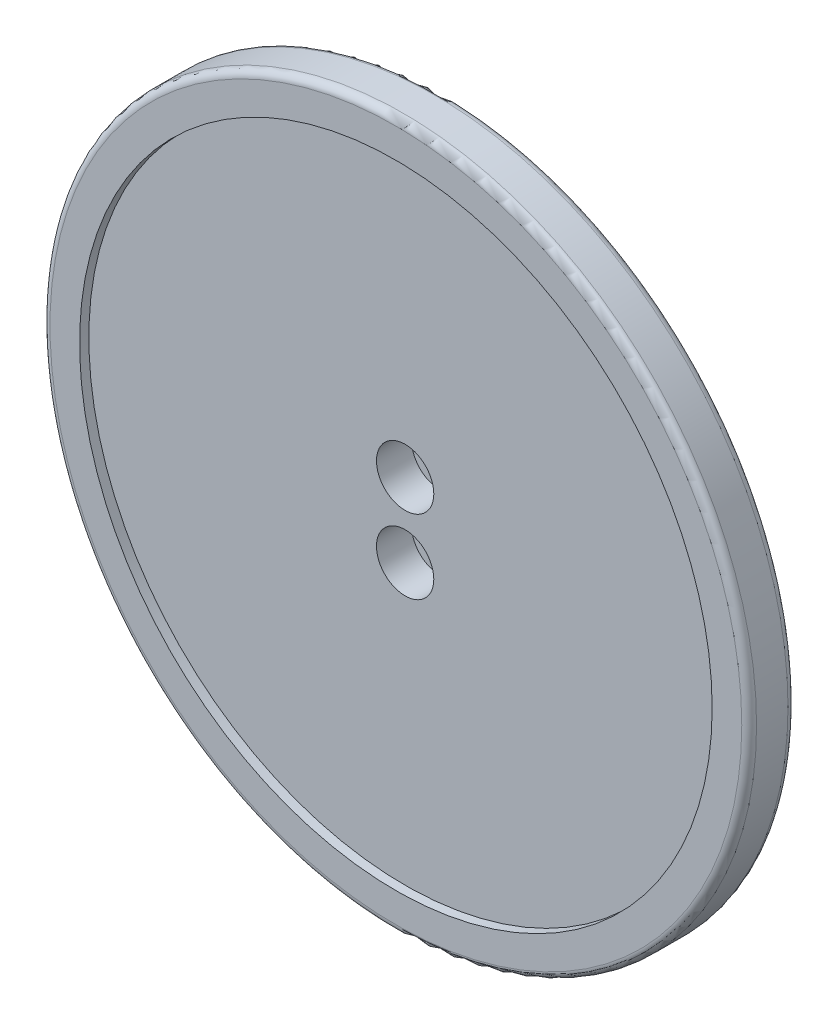
ISO-10303-21;
HEADER;
FILE_DESCRIPTION(('STEP AP214'),'2;1');
FILE_NAME('part.step','',(''),(''),'','','');
FILE_SCHEMA(('AUTOMOTIVE_DESIGN { 1 0 10303 214 1 1 1 1 }'));
ENDSEC;
DATA;
#1=APPLICATION_CONTEXT('core data for automotive mechanical design processes');
#2=APPLICATION_PROTOCOL_DEFINITION('international standard','automotive_design',2000,#1);
#3=PRODUCT_CONTEXT('',#1,'mechanical');
#4=PRODUCT('Part','Part','',(#3));
#5=PRODUCT_RELATED_PRODUCT_CATEGORY('part','',(#4));
#6=PRODUCT_DEFINITION_FORMATION('','',#4);
#7=PRODUCT_DEFINITION_CONTEXT('part definition',#1,'design');
#8=PRODUCT_DEFINITION('design','',#6,#7);
#9=PRODUCT_DEFINITION_SHAPE('','',#8);
#10=(LENGTH_UNIT() NAMED_UNIT(*) SI_UNIT(.MILLI.,.METRE.));
#11=(NAMED_UNIT(*) PLANE_ANGLE_UNIT() SI_UNIT($,.RADIAN.));
#12=(NAMED_UNIT(*) SI_UNIT($,.STERADIAN.) SOLID_ANGLE_UNIT());
#13=UNCERTAINTY_MEASURE_WITH_UNIT(LENGTH_MEASURE(1.E-05),#10,'distance_accuracy_value','');
#14=(GEOMETRIC_REPRESENTATION_CONTEXT(3) GLOBAL_UNCERTAINTY_ASSIGNED_CONTEXT((#13)) GLOBAL_UNIT_ASSIGNED_CONTEXT((#10,
#11,#12)) REPRESENTATION_CONTEXT('',''));
#15=CARTESIAN_POINT('',(0.,0.,0.));
#16=DIRECTION('',(0.,0.,1.));
#17=DIRECTION('',(1.,0.,0.));
#18=AXIS2_PLACEMENT_3D('',#15,#16,#17);
#19=CARTESIAN_POINT('',(0.,0.,-5.));
#20=DIRECTION('',(0.,0.,-1.));
#21=DIRECTION('',(-1.,0.,0.));
#22=AXIS2_PLACEMENT_3D('',#19,#20,#21);
#23=PLANE('',#22);
#24=CARTESIAN_POINT('',(0.,0.,-5.));
#25=DIRECTION('',(0.,0.,-1.));
#26=DIRECTION('',(-1.,0.,0.));
#27=AXIS2_PLACEMENT_3D('',#24,#25,#26);
#28=CIRCLE('',#27,46.75);
#29=CARTESIAN_POINT('',(-46.75,0.,-5.));
#30=VERTEX_POINT('',#29);
#31=EDGE_CURVE('E165',#30,#30,#28,.T.);
#32=ORIENTED_EDGE('',*,*,#31,.T.);
#33=EDGE_LOOP('',(#32));
#34=FACE_BOUND('',#33,.T.);
#35=DIRECTION('',(0.,-1.,0.));
#36=VECTOR('',#35,1.);
#37=CARTESIAN_POINT('',(-16.35,-10.,-5.));
#38=LINE('',#37,#36);
#39=CARTESIAN_POINT('',(-16.35,20.,-5.));
#40=VERTEX_POINT('',#39);
#41=CARTESIAN_POINT('',(-16.35,-20.,-5.));
#42=VERTEX_POINT('',#41);
#43=EDGE_CURVE('E63',#40,#42,#38,.T.);
#44=ORIENTED_EDGE('',*,*,#43,.T.);
#45=DIRECTION('',(1.,0.,0.));
#46=VECTOR('',#45,1.);
#47=CARTESIAN_POINT('',(6.35,-20.,-5.));
#48=LINE('',#47,#46);
#49=CARTESIAN_POINT('',(16.35,-20.,-5.));
#50=VERTEX_POINT('',#49);
#51=EDGE_CURVE('E162',#42,#50,#48,.T.);
#52=ORIENTED_EDGE('',*,*,#51,.T.);
#53=DIRECTION('',(0.,-1.,0.));
#54=VECTOR('',#53,1.);
#55=CARTESIAN_POINT('',(16.35,0.,-5.));
#56=LINE('',#55,#54);
#57=CARTESIAN_POINT('',(16.35,20.,-5.));
#58=VERTEX_POINT('',#57);
#59=EDGE_CURVE('E144',#50,#58,#56,.F.);
#60=ORIENTED_EDGE('',*,*,#59,.T.);
#61=DIRECTION('',(1.,0.,0.));
#62=VECTOR('',#61,1.);
#63=CARTESIAN_POINT('',(0.,20.,-5.));
#64=LINE('',#63,#62);
#65=EDGE_CURVE('E68',#58,#40,#64,.F.);
#66=ORIENTED_EDGE('',*,*,#65,.T.);
#67=EDGE_LOOP('',(#44,#52,#60,#66));
#68=FACE_BOUND('',#67,.T.);
#69=ADVANCED_FACE('F47',(#34,#68),#23,.T.);
#70=CARTESIAN_POINT('',(0.,-5.,-5.));
#71=DIRECTION('',(0.,0.,1.));
#72=DIRECTION('',(1.,0.,0.));
#73=AXIS2_PLACEMENT_3D('',#70,#71,#72);
#74=CYLINDRICAL_SURFACE('',#73,2.25);
#75=CARTESIAN_POINT('',(0.,-5.,-4.75));
#76=DIRECTION('',(0.,0.,1.));
#77=DIRECTION('',(1.,0.,0.));
#78=AXIS2_PLACEMENT_3D('',#75,#76,#77);
#79=CIRCLE('',#78,2.25);
#80=CARTESIAN_POINT('',(2.25,-5.,-4.75));
#81=VERTEX_POINT('',#80);
#82=EDGE_CURVE('E149',#81,#81,#79,.T.);
#83=ORIENTED_EDGE('',*,*,#82,.T.);
#84=EDGE_LOOP('',(#83));
#85=FACE_BOUND('',#84,.T.);
#86=CARTESIAN_POINT('',(0.,-5.,-15.));
#87=DIRECTION('',(0.,0.,-1.));
#88=DIRECTION('',(-1.,0.,0.));
#89=AXIS2_PLACEMENT_3D('',#86,#87,#88);
#90=CIRCLE('',#89,2.25);
#91=CARTESIAN_POINT('',(-2.25,-5.,-15.));
#92=VERTEX_POINT('',#91);
#93=EDGE_CURVE('E172',#92,#92,#90,.F.);
#94=ORIENTED_EDGE('',*,*,#93,.F.);
#95=EDGE_LOOP('',(#94));
#96=FACE_BOUND('',#95,.T.);
#97=ADVANCED_FACE('F193',(#85,#96),#74,.F.);
#98=CARTESIAN_POINT('',(0.,5.,-5.));
#99=DIRECTION('',(0.,0.,1.));
#100=DIRECTION('',(1.,0.,0.));
#101=AXIS2_PLACEMENT_3D('',#98,#99,#100);
#102=CYLINDRICAL_SURFACE('',#101,2.25);
#103=CARTESIAN_POINT('',(0.,5.,-4.75));
#104=DIRECTION('',(0.,0.,1.));
#105=DIRECTION('',(1.,0.,0.));
#106=AXIS2_PLACEMENT_3D('',#103,#104,#105);
#107=CIRCLE('',#106,2.25);
#108=CARTESIAN_POINT('',(2.25,5.,-4.75));
#109=VERTEX_POINT('',#108);
#110=EDGE_CURVE('E128',#109,#109,#107,.T.);
#111=ORIENTED_EDGE('',*,*,#110,.T.);
#112=EDGE_LOOP('',(#111));
#113=FACE_BOUND('',#112,.T.);
#114=CARTESIAN_POINT('',(0.,5.,-15.));
#115=DIRECTION('',(0.,0.,-1.));
#116=DIRECTION('',(-1.,0.,0.));
#117=AXIS2_PLACEMENT_3D('',#114,#115,#116);
#118=CIRCLE('',#117,2.25);
#119=CARTESIAN_POINT('',(-2.25,5.,-15.));
#120=VERTEX_POINT('',#119);
#121=EDGE_CURVE('E100',#120,#120,#118,.F.);
#122=ORIENTED_EDGE('',*,*,#121,.F.);
#123=EDGE_LOOP('',(#122));
#124=FACE_BOUND('',#123,.T.);
#125=ADVANCED_FACE('F200',(#113,#124),#102,.F.);
#126=CARTESIAN_POINT('',(0.,0.,1.25));
#127=DIRECTION('',(0.,0.,1.));
#128=DIRECTION('',(1.,0.,0.));
#129=AXIS2_PLACEMENT_3D('',#126,#127,#128);
#130=PLANE('',#129);
#131=CARTESIAN_POINT('',(0.,0.,1.25));
#132=DIRECTION('',(0.,0.,1.));
#133=DIRECTION('',(1.,0.,0.));
#134=AXIS2_PLACEMENT_3D('',#131,#132,#133);
#135=CIRCLE('',#134,46.75);
#136=CARTESIAN_POINT('',(46.75,0.,1.25));
#137=VERTEX_POINT('',#136);
#138=EDGE_CURVE('E11',#137,#137,#135,.T.);
#139=ORIENTED_EDGE('',*,*,#138,.T.);
#140=EDGE_LOOP('',(#139));
#141=FACE_BOUND('',#140,.T.);
#142=CARTESIAN_POINT('',(0.,0.,1.25));
#143=DIRECTION('',(0.,0.,1.));
#144=DIRECTION('',(1.,0.,0.));
#145=AXIS2_PLACEMENT_3D('',#142,#143,#144);
#146=CIRCLE('',#145,42.75);
#147=CARTESIAN_POINT('',(42.75,0.,1.25));
#148=VERTEX_POINT('',#147);
#149=EDGE_CURVE('E140',#148,#148,#146,.T.);
#150=ORIENTED_EDGE('',*,*,#149,.F.);
#151=EDGE_LOOP('',(#150));
#152=FACE_BOUND('',#151,.T.);
#153=ADVANCED_FACE('F214',(#141,#152),#130,.T.);
#154=CARTESIAN_POINT('',(0.,0.,1.25));
#155=DIRECTION('',(0.,0.,-1.));
#156=DIRECTION('',(-1.,0.,0.));
#157=AXIS2_PLACEMENT_3D('',#154,#155,#156);
#158=CYLINDRICAL_SURFACE('',#157,47.75);
#159=CARTESIAN_POINT('',(0.,0.,-4.));
#160=DIRECTION('',(0.,0.,-1.));
#161=DIRECTION('',(-1.,0.,0.));
#162=AXIS2_PLACEMENT_3D('',#159,#160,#161);
#163=CIRCLE('',#162,47.75);
#164=CARTESIAN_POINT('',(-47.75,0.,-4.));
#165=VERTEX_POINT('',#164);
#166=EDGE_CURVE('E56',#165,#165,#163,.F.);
#167=ORIENTED_EDGE('',*,*,#166,.T.);
#168=EDGE_LOOP('',(#167));
#169=FACE_BOUND('',#168,.T.);
#170=CARTESIAN_POINT('',(0.,0.,0.25));
#171=DIRECTION('',(0.,0.,1.));
#172=DIRECTION('',(1.,0.,0.));
#173=AXIS2_PLACEMENT_3D('',#170,#171,#172);
#174=CIRCLE('',#173,47.75);
#175=CARTESIAN_POINT('',(47.75,0.,0.25));
#176=VERTEX_POINT('',#175);
#177=EDGE_CURVE('E176',#176,#176,#174,.F.);
#178=ORIENTED_EDGE('',*,*,#177,.T.);
#179=EDGE_LOOP('',(#178));
#180=FACE_BOUND('',#179,.T.);
#181=ADVANCED_FACE('F183',(#169,#180),#158,.T.);
#182=CARTESIAN_POINT('',(0.,0.,1.25));
#183=DIRECTION('',(0.,0.,-1.));
#184=DIRECTION('',(-1.,0.,0.));
#185=AXIS2_PLACEMENT_3D('',#182,#183,#184);
#186=CYLINDRICAL_SURFACE('',#185,42.75);
#187=ORIENTED_EDGE('',*,*,#149,.T.);
#188=EDGE_LOOP('',(#187));
#189=FACE_BOUND('',#188,.T.);
#190=CARTESIAN_POINT('',(0.,0.,0.));
#191=DIRECTION('',(0.,0.,1.));
#192=DIRECTION('',(1.,0.,0.));
#193=AXIS2_PLACEMENT_3D('',#190,#191,#192);
#194=CIRCLE('',#193,42.75);
#195=CARTESIAN_POINT('',(42.75,0.,0.));
#196=VERTEX_POINT('',#195);
#197=EDGE_CURVE('E145',#196,#196,#194,.T.);
#198=ORIENTED_EDGE('',*,*,#197,.F.);
#199=EDGE_LOOP('',(#198));
#200=FACE_BOUND('',#199,.T.);
#201=ADVANCED_FACE('F209',(#189,#200),#186,.F.);
#202=CARTESIAN_POINT('',(0.,0.,0.));
#203=DIRECTION('',(0.,0.,-1.));
#204=DIRECTION('',(-1.,0.,0.));
#205=AXIS2_PLACEMENT_3D('',#202,#203,#204);
#206=PLANE('',#205);
#207=CARTESIAN_POINT('',(0.,5.,0.));
#208=DIRECTION('',(0.,0.,1.));
#209=DIRECTION('',(1.,0.,0.));
#210=AXIS2_PLACEMENT_3D('',#207,#208,#209);
#211=CIRCLE('',#210,3.875);
#212=CARTESIAN_POINT('',(3.875,5.,0.));
#213=VERTEX_POINT('',#212);
#214=EDGE_CURVE('E129',#213,#213,#211,.T.);
#215=ORIENTED_EDGE('',*,*,#214,.F.);
#216=EDGE_LOOP('',(#215));
#217=FACE_BOUND('',#216,.T.);
#218=CARTESIAN_POINT('',(0.,-5.,0.));
#219=DIRECTION('',(0.,0.,1.));
#220=DIRECTION('',(1.,0.,0.));
#221=AXIS2_PLACEMENT_3D('',#218,#219,#220);
#222=CIRCLE('',#221,3.875);
#223=CARTESIAN_POINT('',(3.875,-5.,0.));
#224=VERTEX_POINT('',#223);
#225=EDGE_CURVE('E133',#224,#224,#222,.T.);
#226=ORIENTED_EDGE('',*,*,#225,.F.);
#227=EDGE_LOOP('',(#226));
#228=FACE_BOUND('',#227,.T.);
#229=ORIENTED_EDGE('',*,*,#197,.T.);
#230=EDGE_LOOP('',(#229));
#231=FACE_BOUND('',#230,.T.);
#232=ADVANCED_FACE('F205',(#217,#228,#231),#206,.F.);
#233=CARTESIAN_POINT('',(0.,5.,-4.75));
#234=DIRECTION('',(0.,0.,1.));
#235=DIRECTION('',(1.,0.,0.));
#236=AXIS2_PLACEMENT_3D('',#233,#234,#235);
#237=CYLINDRICAL_SURFACE('',#236,3.875);
#238=CARTESIAN_POINT('',(0.,5.,-4.75));
#239=DIRECTION('',(0.,0.,1.));
#240=DIRECTION('',(1.,0.,0.));
#241=AXIS2_PLACEMENT_3D('',#238,#239,#240);
#242=CIRCLE('',#241,3.875);
#243=CARTESIAN_POINT('',(3.875,5.,-4.75));
#244=VERTEX_POINT('',#243);
#245=EDGE_CURVE('E124',#244,#244,#242,.T.);
#246=ORIENTED_EDGE('',*,*,#245,.F.);
#247=EDGE_LOOP('',(#246));
#248=FACE_BOUND('',#247,.T.);
#249=ORIENTED_EDGE('',*,*,#214,.T.);
#250=EDGE_LOOP('',(#249));
#251=FACE_BOUND('',#250,.T.);
#252=ADVANCED_FACE('F208',(#248,#251),#237,.F.);
#253=CARTESIAN_POINT('',(0.,5.,-4.75));
#254=DIRECTION('',(0.,0.,1.));
#255=DIRECTION('',(1.,0.,0.));
#256=AXIS2_PLACEMENT_3D('',#253,#254,#255);
#257=PLANE('',#256);
#258=ORIENTED_EDGE('',*,*,#110,.F.);
#259=EDGE_LOOP('',(#258));
#260=FACE_BOUND('',#259,.T.);
#261=ORIENTED_EDGE('',*,*,#245,.T.);
#262=EDGE_LOOP('',(#261));
#263=FACE_BOUND('',#262,.T.);
#264=ADVANCED_FACE('F244',(#260,#263),#257,.T.);
#265=CARTESIAN_POINT('',(0.,-5.,-4.75));
#266=DIRECTION('',(0.,0.,1.));
#267=DIRECTION('',(1.,0.,0.));
#268=AXIS2_PLACEMENT_3D('',#265,#266,#267);
#269=CYLINDRICAL_SURFACE('',#268,3.875);
#270=CARTESIAN_POINT('',(0.,-5.,-4.75));
#271=DIRECTION('',(0.,0.,1.));
#272=DIRECTION('',(1.,0.,0.));
#273=AXIS2_PLACEMENT_3D('',#270,#271,#272);
#274=CIRCLE('',#273,3.875);
#275=CARTESIAN_POINT('',(3.875,-5.,-4.75));
#276=VERTEX_POINT('',#275);
#277=EDGE_CURVE('E123',#276,#276,#274,.T.);
#278=ORIENTED_EDGE('',*,*,#277,.F.);
#279=EDGE_LOOP('',(#278));
#280=FACE_BOUND('',#279,.T.);
#281=ORIENTED_EDGE('',*,*,#225,.T.);
#282=EDGE_LOOP('',(#281));
#283=FACE_BOUND('',#282,.T.);
#284=ADVANCED_FACE('F238',(#280,#283),#269,.F.);
#285=CARTESIAN_POINT('',(0.,-5.,-4.75));
#286=DIRECTION('',(0.,0.,1.));
#287=DIRECTION('',(1.,0.,0.));
#288=AXIS2_PLACEMENT_3D('',#285,#286,#287);
#289=PLANE('',#288);
#290=ORIENTED_EDGE('',*,*,#82,.F.);
#291=EDGE_LOOP('',(#290));
#292=FACE_BOUND('',#291,.T.);
#293=ORIENTED_EDGE('',*,*,#277,.T.);
#294=EDGE_LOOP('',(#293));
#295=FACE_BOUND('',#294,.T.);
#296=ADVANCED_FACE('F231',(#292,#295),#289,.T.);
#297=CARTESIAN_POINT('',(0.,0.,-15.));
#298=DIRECTION('',(0.,0.,-1.));
#299=DIRECTION('',(-1.,0.,0.));
#300=AXIS2_PLACEMENT_3D('',#297,#298,#299);
#301=PLANE('',#300);
#302=ORIENTED_EDGE('',*,*,#93,.T.);
#303=EDGE_LOOP('',(#302));
#304=FACE_BOUND('',#303,.T.);
#305=ORIENTED_EDGE('',*,*,#121,.T.);
#306=EDGE_LOOP('',(#305));
#307=FACE_BOUND('',#306,.T.);
#308=DIRECTION('',(1.,0.,0.));
#309=VECTOR('',#308,1.);
#310=CARTESIAN_POINT('',(0.,10.,-15.));
#311=LINE('',#310,#309);
#312=CARTESIAN_POINT('',(-6.35,10.,-15.));
#313=VERTEX_POINT('',#312);
#314=CARTESIAN_POINT('',(6.35,10.,-15.));
#315=VERTEX_POINT('',#314);
#316=EDGE_CURVE('E88',#313,#315,#311,.T.);
#317=ORIENTED_EDGE('',*,*,#316,.T.);
#318=DIRECTION('',(0.,-1.,0.));
#319=VECTOR('',#318,1.);
#320=CARTESIAN_POINT('',(6.35,0.,-15.));
#321=LINE('',#320,#319);
#322=CARTESIAN_POINT('',(6.35,-10.,-15.));
#323=VERTEX_POINT('',#322);
#324=EDGE_CURVE('E93',#315,#323,#321,.T.);
#325=ORIENTED_EDGE('',*,*,#324,.T.);
#326=DIRECTION('',(1.,0.,0.));
#327=VECTOR('',#326,1.);
#328=CARTESIAN_POINT('',(0.,-10.,-15.));
#329=LINE('',#328,#327);
#330=CARTESIAN_POINT('',(-6.35,-10.,-15.));
#331=VERTEX_POINT('',#330);
#332=EDGE_CURVE('E115',#331,#323,#329,.T.);
#333=ORIENTED_EDGE('',*,*,#332,.F.);
#334=DIRECTION('',(0.,-1.,0.));
#335=VECTOR('',#334,1.);
#336=CARTESIAN_POINT('',(-6.35,0.,-15.));
#337=LINE('',#336,#335);
#338=EDGE_CURVE('E96',#313,#331,#337,.T.);
#339=ORIENTED_EDGE('',*,*,#338,.F.);
#340=EDGE_LOOP('',(#317,#325,#333,#339));
#341=FACE_BOUND('',#340,.T.);
#342=ADVANCED_FACE('F90',(#304,#307,#341),#301,.T.);
#343=CARTESIAN_POINT('',(0.,20.,-15.));
#344=DIRECTION('',(1.,0.,0.));
#345=DIRECTION('',(0.,0.,-1.));
#346=AXIS2_PLACEMENT_3D('',#343,#344,#345);
#347=CYLINDRICAL_SURFACE('',#346,10.);
#348=CARTESIAN_POINT('',(16.35,20.,-15.));
#349=DIRECTION('',(0.707106781186547,-0.707106781186547,0.));
#350=DIRECTION('',(-0.707106781186547,-0.707106781186547,0.));
#351=AXIS2_PLACEMENT_3D('',#348,#349,#350);
#352=ELLIPSE('',#351,14.1421356237309,10.);
#353=EDGE_CURVE('E103',#315,#58,#352,.F.);
#354=ORIENTED_EDGE('',*,*,#353,.F.);
#355=ORIENTED_EDGE('',*,*,#316,.F.);
#356=CARTESIAN_POINT('',(-16.35,20.,-15.));
#357=DIRECTION('',(0.707106781186547,0.707106781186547,0.));
#358=DIRECTION('',(0.707106781186547,-0.707106781186547,0.));
#359=AXIS2_PLACEMENT_3D('',#356,#357,#358);
#360=ELLIPSE('',#359,14.1421356237309,10.);
#361=EDGE_CURVE('E108',#40,#313,#360,.T.);
#362=ORIENTED_EDGE('',*,*,#361,.F.);
#363=ORIENTED_EDGE('',*,*,#65,.F.);
#364=EDGE_LOOP('',(#354,#355,#362,#363));
#365=FACE_BOUND('',#364,.T.);
#366=ADVANCED_FACE('F104',(#365),#347,.F.);
#367=CARTESIAN_POINT('',(-16.35,0.,-15.));
#368=DIRECTION('',(0.,1.,0.));
#369=DIRECTION('',(0.,0.,1.));
#370=AXIS2_PLACEMENT_3D('',#367,#368,#369);
#371=CYLINDRICAL_SURFACE('',#370,10.);
#372=ORIENTED_EDGE('',*,*,#361,.T.);
#373=ORIENTED_EDGE('',*,*,#338,.T.);
#374=CARTESIAN_POINT('',(-16.35,-20.,-15.));
#375=DIRECTION('',(-0.707106781186547,0.707106781186547,0.));
#376=DIRECTION('',(0.707106781186547,0.707106781186547,0.));
#377=AXIS2_PLACEMENT_3D('',#374,#375,#376);
#378=ELLIPSE('',#377,14.1421356237309,10.);
#379=EDGE_CURVE('E109',#42,#331,#378,.T.);
#380=ORIENTED_EDGE('',*,*,#379,.F.);
#381=ORIENTED_EDGE('',*,*,#43,.F.);
#382=EDGE_LOOP('',(#372,#373,#380,#381));
#383=FACE_BOUND('',#382,.T.);
#384=ADVANCED_FACE('F223',(#383),#371,.F.);
#385=CARTESIAN_POINT('',(16.35,0.,-15.));
#386=DIRECTION('',(0.,-1.,0.));
#387=DIRECTION('',(0.,0.,-1.));
#388=AXIS2_PLACEMENT_3D('',#385,#386,#387);
#389=CYLINDRICAL_SURFACE('',#388,10.);
#390=ORIENTED_EDGE('',*,*,#353,.T.);
#391=ORIENTED_EDGE('',*,*,#59,.F.);
#392=CARTESIAN_POINT('',(16.35,-20.,-15.));
#393=DIRECTION('',(-0.707106781186547,-0.707106781186547,0.));
#394=DIRECTION('',(0.707106781186547,-0.707106781186547,0.));
#395=AXIS2_PLACEMENT_3D('',#392,#393,#394);
#396=ELLIPSE('',#395,14.1421356237309,10.);
#397=EDGE_CURVE('E113',#323,#50,#396,.F.);
#398=ORIENTED_EDGE('',*,*,#397,.F.);
#399=ORIENTED_EDGE('',*,*,#324,.F.);
#400=EDGE_LOOP('',(#390,#391,#398,#399));
#401=FACE_BOUND('',#400,.T.);
#402=ADVANCED_FACE('F112',(#401),#389,.F.);
#403=CARTESIAN_POINT('',(0.,-20.,-15.));
#404=DIRECTION('',(-1.,0.,0.));
#405=DIRECTION('',(0.,0.,1.));
#406=AXIS2_PLACEMENT_3D('',#403,#404,#405);
#407=CYLINDRICAL_SURFACE('',#406,10.);
#408=ORIENTED_EDGE('',*,*,#379,.T.);
#409=ORIENTED_EDGE('',*,*,#332,.T.);
#410=ORIENTED_EDGE('',*,*,#397,.T.);
#411=ORIENTED_EDGE('',*,*,#51,.F.);
#412=EDGE_LOOP('',(#408,#409,#410,#411));
#413=FACE_BOUND('',#412,.T.);
#414=ADVANCED_FACE('F189',(#413),#407,.F.);
#415=CARTESIAN_POINT('',(0.,0.,-4.));
#416=DIRECTION('',(0.,0.,-1.));
#417=DIRECTION('',(-1.,0.,0.));
#418=AXIS2_PLACEMENT_3D('',#415,#416,#417);
#419=TOROIDAL_SURFACE('',#418,46.75,1.);
#420=ORIENTED_EDGE('',*,*,#166,.F.);
#421=EDGE_LOOP('',(#420));
#422=FACE_BOUND('',#421,.T.);
#423=ORIENTED_EDGE('',*,*,#31,.F.);
#424=EDGE_LOOP('',(#423));
#425=FACE_BOUND('',#424,.T.);
#426=ADVANCED_FACE('F186',(#422,#425),#419,.T.);
#427=CARTESIAN_POINT('',(0.,0.,0.25));
#428=DIRECTION('',(0.,0.,1.));
#429=DIRECTION('',(1.,0.,0.));
#430=AXIS2_PLACEMENT_3D('',#427,#428,#429);
#431=TOROIDAL_SURFACE('',#430,46.75,1.);
#432=ORIENTED_EDGE('',*,*,#177,.F.);
#433=EDGE_LOOP('',(#432));
#434=FACE_BOUND('',#433,.T.);
#435=ORIENTED_EDGE('',*,*,#138,.F.);
#436=EDGE_LOOP('',(#435));
#437=FACE_BOUND('',#436,.T.);
#438=ADVANCED_FACE('F49',(#434,#437),#431,.T.);
#439=CLOSED_SHELL('',(#69,#97,#125,#153,#181,#201,#232,#252,#264,#284,#296,#342,#366,#384,#402,
#414,#426,#438));
#440=MANIFOLD_SOLID_BREP('B2',#439);
#441=ADVANCED_BREP_SHAPE_REPRESENTATION('',(#18,#440),#14);
#442=SHAPE_DEFINITION_REPRESENTATION(#9,#441);
ENDSEC;
END-ISO-10303-21;
